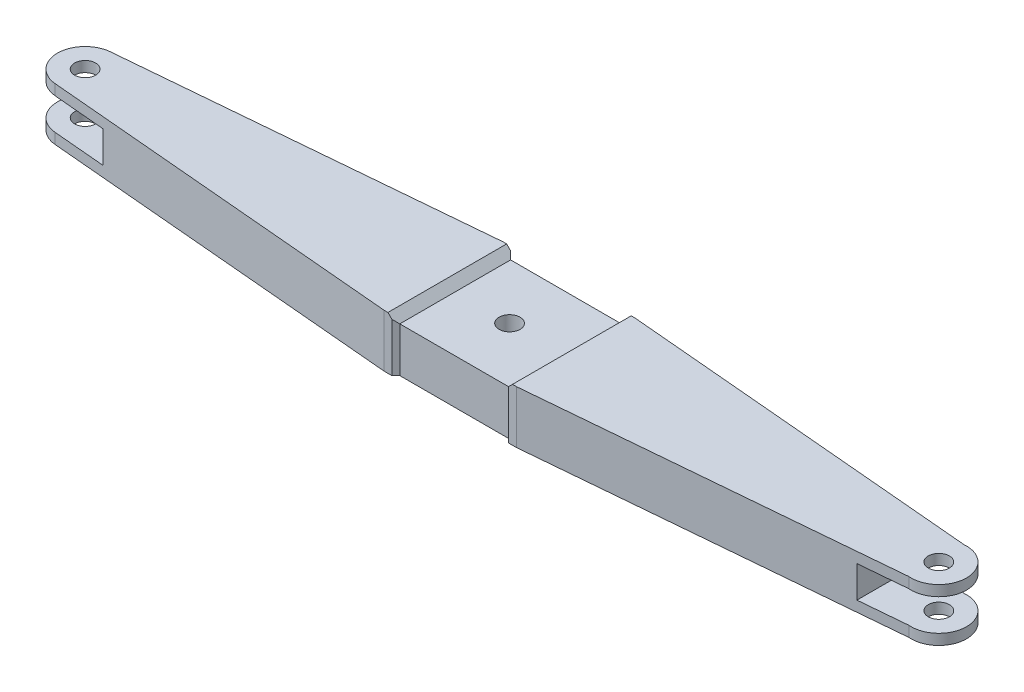
ISO-10303-21;
HEADER;
FILE_DESCRIPTION(('STEP AP214'),'2;1');
FILE_NAME('part.step','',(''),(''),'','','');
FILE_SCHEMA(('AUTOMOTIVE_DESIGN { 1 0 10303 214 1 1 1 1 }'));
ENDSEC;
DATA;
#1=APPLICATION_CONTEXT('core data for automotive mechanical design processes');
#2=APPLICATION_PROTOCOL_DEFINITION('international standard','automotive_design',2000,#1);
#3=PRODUCT_CONTEXT('',#1,'mechanical');
#4=PRODUCT('Part','Part','',(#3));
#5=PRODUCT_RELATED_PRODUCT_CATEGORY('part','',(#4));
#6=PRODUCT_DEFINITION_FORMATION('','',#4);
#7=PRODUCT_DEFINITION_CONTEXT('part definition',#1,'design');
#8=PRODUCT_DEFINITION('design','',#6,#7);
#9=PRODUCT_DEFINITION_SHAPE('','',#8);
#10=(LENGTH_UNIT() NAMED_UNIT(*) SI_UNIT(.MILLI.,.METRE.));
#11=(NAMED_UNIT(*) PLANE_ANGLE_UNIT() SI_UNIT($,.RADIAN.));
#12=(NAMED_UNIT(*) SI_UNIT($,.STERADIAN.) SOLID_ANGLE_UNIT());
#13=UNCERTAINTY_MEASURE_WITH_UNIT(LENGTH_MEASURE(1.E-05),#10,'distance_accuracy_value','');
#14=(GEOMETRIC_REPRESENTATION_CONTEXT(3) GLOBAL_UNCERTAINTY_ASSIGNED_CONTEXT((#13)) GLOBAL_UNIT_ASSIGNED_CONTEXT((#10,
#11,#12)) REPRESENTATION_CONTEXT('',''));
#15=CARTESIAN_POINT('',(0.,0.,0.));
#16=DIRECTION('',(0.,0.,1.));
#17=DIRECTION('',(1.,0.,0.));
#18=AXIS2_PLACEMENT_3D('',#15,#16,#17);
#19=CARTESIAN_POINT('',(162.738204711135,20.,-1.80061182069804E-13));
#20=DIRECTION('',(0.,1.,0.));
#21=DIRECTION('',(0.,0.,1.));
#22=AXIS2_PLACEMENT_3D('',#19,#20,#21);
#23=PLANE('',#22);
#24=DIRECTION('',(-0.999999999847692,0.,1.74532925184083E-05));
#25=VECTOR('',#24,1.);
#26=CARTESIAN_POINT('',(22.1097734828967,20.,-22.4997734828967));
#27=LINE('',#26,#25);
#28=CARTESIAN_POINT('',(25.1097734824397,20.,-22.4998258427742));
#29=VERTEX_POINT('',#28);
#30=CARTESIAN_POINT('',(23.61,20.,-22.4997996667889));
#31=VERTEX_POINT('',#30);
#32=EDGE_CURVE('E251',#29,#31,#27,.T.);
#33=ORIENTED_EDGE('',*,*,#32,.T.);
#34=DIRECTION('',(0.,0.,1.));
#35=VECTOR('',#34,1.);
#36=CARTESIAN_POINT('',(23.61,20.,21.));
#37=LINE('',#36,#35);
#38=CARTESIAN_POINT('',(23.61,20.,22.4997996667889));
#39=VERTEX_POINT('',#38);
#40=EDGE_CURVE('E325',#31,#39,#37,.T.);
#41=ORIENTED_EDGE('',*,*,#40,.T.);
#42=DIRECTION('',(0.999999999847692,0.,1.74532925207212E-05));
#43=VECTOR('',#42,1.);
#44=CARTESIAN_POINT('',(22.1097734828967,20.,22.4997734828967));
#45=LINE('',#44,#43);
#46=CARTESIAN_POINT('',(25.1097734824397,20.,22.4998258427742));
#47=VERTEX_POINT('',#46);
#48=EDGE_CURVE('E348',#39,#47,#45,.T.);
#49=ORIENTED_EDGE('',*,*,#48,.T.);
#50=DIRECTION('',(0.996144334757296,0.,-0.0877294952165169));
#51=VECTOR('',#50,1.);
#52=CARTESIAN_POINT('',(25.1097734824397,20.,22.4998258427742));
#53=LINE('',#52,#51);
#54=CARTESIAN_POINT('',(161.820621984531,20.,10.4598299192594));
#55=VERTEX_POINT('',#54);
#56=EDGE_CURVE('E418',#47,#55,#53,.T.);
#57=ORIENTED_EDGE('',*,*,#56,.T.);
#58=CARTESIAN_POINT('',(162.738204711135,20.,-1.80061182069804E-13));
#59=DIRECTION('',(0.,1.,0.));
#60=DIRECTION('',(0.,0.,1.));
#61=AXIS2_PLACEMENT_3D('',#58,#59,#60);
#62=CIRCLE('',#61,10.5);
#63=CARTESIAN_POINT('',(161.820621984531,20.,-10.4598299192597));
#64=VERTEX_POINT('',#63);
#65=EDGE_CURVE('E420',#55,#64,#62,.T.);
#66=ORIENTED_EDGE('',*,*,#65,.T.);
#67=DIRECTION('',(-0.996144334757296,0.,-0.0877294952165153));
#68=VECTOR('',#67,1.);
#69=CARTESIAN_POINT('',(25.1097734824397,20.,-22.4998258427742));
#70=LINE('',#69,#68);
#71=EDGE_CURVE('E256',#64,#29,#70,.T.);
#72=ORIENTED_EDGE('',*,*,#71,.T.);
#73=EDGE_LOOP('',(#33,#41,#49,#57,#66,#72));
#74=FACE_BOUND('',#73,.T.);
#75=CARTESIAN_POINT('',(162.738204711135,20.,-1.80061182069804E-13));
#76=DIRECTION('',(0.,1.,0.));
#77=DIRECTION('',(0.,0.,1.));
#78=AXIS2_PLACEMENT_3D('',#75,#76,#77);
#79=CIRCLE('',#78,3.99999999999999);
#80=CARTESIAN_POINT('',(162.738204711135,20.,3.99999999999981));
#81=VERTEX_POINT('',#80);
#82=EDGE_CURVE('E429',#81,#81,#79,.T.);
#83=ORIENTED_EDGE('',*,*,#82,.F.);
#84=EDGE_LOOP('',(#83));
#85=FACE_BOUND('',#84,.T.);
#86=ADVANCED_FACE('F38',(#74,#85),#23,.T.);
#87=CARTESIAN_POINT('',(-160.903039257979,20.,4.885424809878E-12));
#88=DIRECTION('',(0.,-1.,0.));
#89=DIRECTION('',(0.,0.,-1.));
#90=AXIS2_PLACEMENT_3D('',#87,#88,#89);
#91=CYLINDRICAL_SURFACE('',#90,10.5);
#92=DIRECTION('',(0.,-1.,0.));
#93=VECTOR('',#92,1.);
#94=CARTESIAN_POINT('',(-161.820621984532,20.,10.4598299192689));
#95=LINE('',#94,#93);
#96=CARTESIAN_POINT('',(-161.820621984532,4.,10.4598299192689));
#97=VERTEX_POINT('',#96);
#98=CARTESIAN_POINT('',(-161.820621984532,0.,10.4598299192689));
#99=VERTEX_POINT('',#98);
#100=EDGE_CURVE('E285',#97,#99,#95,.T.);
#101=ORIENTED_EDGE('',*,*,#100,.F.);
#102=CARTESIAN_POINT('',(-160.903039257979,4.,4.885424809878E-12));
#103=DIRECTION('',(0.,-1.,0.));
#104=DIRECTION('',(0.,0.,-1.));
#105=AXIS2_PLACEMENT_3D('',#102,#103,#104);
#106=CIRCLE('',#105,10.5);
#107=CARTESIAN_POINT('',(-161.820621984531,4.,-10.4598299192593));
#108=VERTEX_POINT('',#107);
#109=EDGE_CURVE('E445',#97,#108,#106,.T.);
#110=ORIENTED_EDGE('',*,*,#109,.T.);
#111=DIRECTION('',(0.,-1.,0.));
#112=VECTOR('',#111,1.);
#113=CARTESIAN_POINT('',(-161.820621984531,20.,-10.4598299192593));
#114=LINE('',#113,#112);
#115=CARTESIAN_POINT('',(-161.820621984531,0.,-10.4598299192593));
#116=VERTEX_POINT('',#115);
#117=EDGE_CURVE('E289',#108,#116,#114,.T.);
#118=ORIENTED_EDGE('',*,*,#117,.T.);
#119=CARTESIAN_POINT('',(-160.903039257979,0.,4.885424809878E-12));
#120=DIRECTION('',(0.,1.,0.));
#121=DIRECTION('',(0.,0.,1.));
#122=AXIS2_PLACEMENT_3D('',#119,#120,#121);
#123=CIRCLE('',#122,10.5);
#124=EDGE_CURVE('E376',#116,#99,#123,.T.);
#125=ORIENTED_EDGE('',*,*,#124,.T.);
#126=EDGE_LOOP('',(#101,#110,#118,#125));
#127=FACE_BOUND('',#126,.T.);
#128=ADVANCED_FACE('F506',(#127),#91,.T.);
#129=CARTESIAN_POINT('',(162.738204711135,20.,-1.80061182069804E-13));
#130=DIRECTION('',(0.,-1.,0.));
#131=DIRECTION('',(0.,0.,-1.));
#132=AXIS2_PLACEMENT_3D('',#129,#130,#131);
#133=CYLINDRICAL_SURFACE('',#132,10.5);
#134=DIRECTION('',(0.,-1.,0.));
#135=VECTOR('',#134,1.);
#136=CARTESIAN_POINT('',(161.820621984531,20.,-10.4598299192597));
#137=LINE('',#136,#135);
#138=CARTESIAN_POINT('',(161.820621984531,4.,-10.4598299192597));
#139=VERTEX_POINT('',#138);
#140=CARTESIAN_POINT('',(161.820621984531,0.,-10.4598299192597));
#141=VERTEX_POINT('',#140);
#142=EDGE_CURVE('E263',#139,#141,#137,.T.);
#143=ORIENTED_EDGE('',*,*,#142,.F.);
#144=CARTESIAN_POINT('',(162.738204711135,4.,-1.80061182069804E-13));
#145=DIRECTION('',(0.,-1.,0.));
#146=DIRECTION('',(0.,0.,-1.));
#147=AXIS2_PLACEMENT_3D('',#144,#145,#146);
#148=CIRCLE('',#147,10.5);
#149=CARTESIAN_POINT('',(161.820621984531,4.,10.4598299192594));
#150=VERTEX_POINT('',#149);
#151=EDGE_CURVE('E458',#139,#150,#148,.T.);
#152=ORIENTED_EDGE('',*,*,#151,.T.);
#153=DIRECTION('',(0.,-1.,0.));
#154=VECTOR('',#153,1.);
#155=CARTESIAN_POINT('',(161.820621984531,20.,10.4598299192594));
#156=LINE('',#155,#154);
#157=CARTESIAN_POINT('',(161.820621984531,0.,10.4598299192594));
#158=VERTEX_POINT('',#157);
#159=EDGE_CURVE('E267',#150,#158,#156,.T.);
#160=ORIENTED_EDGE('',*,*,#159,.T.);
#161=CARTESIAN_POINT('',(162.738204711135,0.,-1.80061182069804E-13));
#162=DIRECTION('',(0.,1.,0.));
#163=DIRECTION('',(0.,0.,1.));
#164=AXIS2_PLACEMENT_3D('',#161,#162,#163);
#165=CIRCLE('',#164,10.5);
#166=EDGE_CURVE('E399',#158,#141,#165,.T.);
#167=ORIENTED_EDGE('',*,*,#166,.T.);
#168=EDGE_LOOP('',(#143,#152,#160,#167));
#169=FACE_BOUND('',#168,.T.);
#170=ADVANCED_FACE('F512',(#169),#133,.T.);
#171=CARTESIAN_POINT('',(-160.903039257979,20.,4.885424809878E-12));
#172=DIRECTION('',(0.,-1.,0.));
#173=DIRECTION('',(0.,0.,-1.));
#174=AXIS2_PLACEMENT_3D('',#171,#172,#173);
#175=CYLINDRICAL_SURFACE('',#174,3.99999999999999);
#176=CARTESIAN_POINT('',(-160.903039257979,4.,4.885424809878E-12));
#177=DIRECTION('',(0.,-1.,0.));
#178=DIRECTION('',(0.,0.,-1.));
#179=AXIS2_PLACEMENT_3D('',#176,#177,#178);
#180=CIRCLE('',#179,3.99999999999999);
#181=CARTESIAN_POINT('',(-160.903039257979,4.,-3.99999999999511));
#182=VERTEX_POINT('',#181);
#183=EDGE_CURVE('E315',#182,#182,#180,.T.);
#184=ORIENTED_EDGE('',*,*,#183,.F.);
#185=EDGE_LOOP('',(#184));
#186=FACE_BOUND('',#185,.T.);
#187=CARTESIAN_POINT('',(-160.903039257979,0.,4.885424809878E-12));
#188=DIRECTION('',(0.,1.,0.));
#189=DIRECTION('',(0.,0.,1.));
#190=AXIS2_PLACEMENT_3D('',#187,#188,#189);
#191=CIRCLE('',#190,3.99999999999999);
#192=CARTESIAN_POINT('',(-160.903039257979,0.,4.00000000000488));
#193=VERTEX_POINT('',#192);
#194=EDGE_CURVE('E412',#193,#193,#191,.T.);
#195=ORIENTED_EDGE('',*,*,#194,.F.);
#196=EDGE_LOOP('',(#195));
#197=FACE_BOUND('',#196,.T.);
#198=ADVANCED_FACE('F525',(#186,#197),#175,.F.);
#199=CARTESIAN_POINT('',(162.738204711135,20.,-1.80061182069804E-13));
#200=DIRECTION('',(0.,-1.,0.));
#201=DIRECTION('',(0.,0.,-1.));
#202=AXIS2_PLACEMENT_3D('',#199,#200,#201);
#203=CYLINDRICAL_SURFACE('',#202,3.99999999999999);
#204=CARTESIAN_POINT('',(162.738204711135,4.,-1.80061182069804E-13));
#205=DIRECTION('',(0.,-1.,0.));
#206=DIRECTION('',(0.,0.,-1.));
#207=AXIS2_PLACEMENT_3D('',#204,#205,#206);
#208=CIRCLE('',#207,3.99999999999999);
#209=CARTESIAN_POINT('',(162.738204711135,4.,-4.00000000000017));
#210=VERTEX_POINT('',#209);
#211=EDGE_CURVE('E305',#210,#210,#208,.T.);
#212=ORIENTED_EDGE('',*,*,#211,.F.);
#213=EDGE_LOOP('',(#212));
#214=FACE_BOUND('',#213,.T.);
#215=CARTESIAN_POINT('',(162.738204711135,0.,-1.80061182069804E-13));
#216=DIRECTION('',(0.,1.,0.));
#217=DIRECTION('',(0.,0.,1.));
#218=AXIS2_PLACEMENT_3D('',#215,#216,#217);
#219=CIRCLE('',#218,3.99999999999999);
#220=CARTESIAN_POINT('',(162.738204711135,0.,3.99999999999981));
#221=VERTEX_POINT('',#220);
#222=EDGE_CURVE('E431',#221,#221,#219,.T.);
#223=ORIENTED_EDGE('',*,*,#222,.F.);
#224=EDGE_LOOP('',(#223));
#225=FACE_BOUND('',#224,.T.);
#226=ADVANCED_FACE('F520',(#214,#225),#203,.F.);
#227=DIRECTION('',(0.999999999847691,0.,-1.74532925137825E-05));
#228=VECTOR('',#227,1.);
#229=CARTESIAN_POINT('',(-22.1097734828967,20.,22.4997734828967));
#230=LINE('',#229,#228);
#231=CARTESIAN_POINT('',(-25.1097734824397,20.,22.4998258427742));
#232=VERTEX_POINT('',#231);
#233=CARTESIAN_POINT('',(-23.61,20.,22.4997996667889));
#234=VERTEX_POINT('',#233);
#235=EDGE_CURVE('E340',#232,#234,#230,.T.);
#236=ORIENTED_EDGE('',*,*,#235,.T.);
#237=DIRECTION('',(0.,0.,-1.));
#238=VECTOR('',#237,1.);
#239=CARTESIAN_POINT('',(-23.61,20.,-21.));
#240=LINE('',#239,#238);
#241=CARTESIAN_POINT('',(-23.61,20.,-22.4997996667889));
#242=VERTEX_POINT('',#241);
#243=EDGE_CURVE('E61',#234,#242,#240,.T.);
#244=ORIENTED_EDGE('',*,*,#243,.T.);
#245=DIRECTION('',(-0.999999999847692,0.,-1.74532925172518E-05));
#246=VECTOR('',#245,1.);
#247=CARTESIAN_POINT('',(-22.1097734828967,20.,-22.4997734828967));
#248=LINE('',#247,#246);
#249=CARTESIAN_POINT('',(-25.1097734824397,20.,-22.4998258427742));
#250=VERTEX_POINT('',#249);
#251=EDGE_CURVE('E407',#242,#250,#248,.T.);
#252=ORIENTED_EDGE('',*,*,#251,.T.);
#253=DIRECTION('',(-0.996144334757296,0.,0.0877294952165174));
#254=VECTOR('',#253,1.);
#255=CARTESIAN_POINT('',(-25.1097734824397,20.,-22.4998258427742));
#256=LINE('',#255,#254);
#257=CARTESIAN_POINT('',(-161.820621984531,20.,-10.4598299192593));
#258=VERTEX_POINT('',#257);
#259=EDGE_CURVE('E371',#250,#258,#256,.T.);
#260=ORIENTED_EDGE('',*,*,#259,.T.);
#261=CARTESIAN_POINT('',(-160.903039257979,20.,4.885424809878E-12));
#262=DIRECTION('',(0.,1.,0.));
#263=DIRECTION('',(0.,0.,1.));
#264=AXIS2_PLACEMENT_3D('',#261,#262,#263);
#265=CIRCLE('',#264,10.5);
#266=CARTESIAN_POINT('',(-161.820621984532,20.,10.4598299192689));
#267=VERTEX_POINT('',#266);
#268=EDGE_CURVE('E409',#258,#267,#265,.T.);
#269=ORIENTED_EDGE('',*,*,#268,.T.);
#270=DIRECTION('',(0.996144334757302,0.,0.0877294952164476));
#271=VECTOR('',#270,1.);
#272=CARTESIAN_POINT('',(-25.1097734824397,20.,22.4998258427742));
#273=LINE('',#272,#271);
#274=EDGE_CURVE('E346',#267,#232,#273,.T.);
#275=ORIENTED_EDGE('',*,*,#274,.T.);
#276=EDGE_LOOP('',(#236,#244,#252,#260,#269,#275));
#277=FACE_BOUND('',#276,.T.);
#278=CARTESIAN_POINT('',(-160.903039257979,20.,4.885424809878E-12));
#279=DIRECTION('',(0.,1.,0.));
#280=DIRECTION('',(0.,0.,1.));
#281=AXIS2_PLACEMENT_3D('',#278,#279,#280);
#282=CIRCLE('',#281,3.99999999999999);
#283=CARTESIAN_POINT('',(-160.903039257979,20.,4.00000000000488));
#284=VERTEX_POINT('',#283);
#285=EDGE_CURVE('E424',#284,#284,#282,.T.);
#286=ORIENTED_EDGE('',*,*,#285,.F.);
#287=EDGE_LOOP('',(#286));
#288=FACE_BOUND('',#287,.T.);
#289=ADVANCED_FACE('F343',(#277,#288),#23,.T.);
#290=CARTESIAN_POINT('',(162.738204711135,0.,-1.80061182069804E-13));
#291=DIRECTION('',(0.,1.,0.));
#292=DIRECTION('',(0.,0.,1.));
#293=AXIS2_PLACEMENT_3D('',#290,#291,#292);
#294=PLANE('',#293);
#295=CARTESIAN_POINT('',(0.,0.,0.));
#296=DIRECTION('',(0.,1.,0.));
#297=DIRECTION('',(0.,0.,1.));
#298=AXIS2_PLACEMENT_3D('',#295,#296,#297);
#299=CIRCLE('',#298,4.);
#300=CARTESIAN_POINT('',(0.,0.,4.));
#301=VERTEX_POINT('',#300);
#302=EDGE_CURVE('E235',#301,#301,#299,.T.);
#303=ORIENTED_EDGE('',*,*,#302,.T.);
#304=EDGE_LOOP('',(#303));
#305=FACE_BOUND('',#304,.T.);
#306=DIRECTION('',(-1.,0.,0.));
#307=VECTOR('',#306,1.);
#308=CARTESIAN_POINT('',(-20.61,0.,-21.));
#309=LINE('',#308,#307);
#310=CARTESIAN_POINT('',(20.61,0.,-21.));
#311=VERTEX_POINT('',#310);
#312=CARTESIAN_POINT('',(-20.61,0.,-21.));
#313=VERTEX_POINT('',#312);
#314=EDGE_CURVE('E423',#311,#313,#309,.T.);
#315=ORIENTED_EDGE('',*,*,#314,.F.);
#316=DIRECTION('',(-0.707106781186548,0.,0.707106781186548));
#317=VECTOR('',#316,1.);
#318=CARTESIAN_POINT('',(20.61,0.,-21.));
#319=LINE('',#318,#317);
#320=CARTESIAN_POINT('',(22.1097734828967,0.,-22.4997734828967));
#321=VERTEX_POINT('',#320);
#322=EDGE_CURVE('E248',#321,#311,#319,.T.);
#323=ORIENTED_EDGE('',*,*,#322,.F.);
#324=DIRECTION('',(-0.999999999847692,0.,1.74532925184083E-05));
#325=VECTOR('',#324,1.);
#326=CARTESIAN_POINT('',(22.1097734828967,0.,-22.4997734828967));
#327=LINE('',#326,#325);
#328=CARTESIAN_POINT('',(25.1097734824397,0.,-22.4998258427742));
#329=VERTEX_POINT('',#328);
#330=EDGE_CURVE('E403',#329,#321,#327,.T.);
#331=ORIENTED_EDGE('',*,*,#330,.F.);
#332=DIRECTION('',(-0.996144334757296,0.,-0.0877294952165153));
#333=VECTOR('',#332,1.);
#334=CARTESIAN_POINT('',(25.1097734824397,0.,-22.4998258427742));
#335=LINE('',#334,#333);
#336=EDGE_CURVE('E402',#141,#329,#335,.T.);
#337=ORIENTED_EDGE('',*,*,#336,.F.);
#338=ORIENTED_EDGE('',*,*,#166,.F.);
#339=DIRECTION('',(0.996144334757296,0.,-0.0877294952165169));
#340=VECTOR('',#339,1.);
#341=CARTESIAN_POINT('',(25.1097734824397,0.,22.4998258427742));
#342=LINE('',#341,#340);
#343=CARTESIAN_POINT('',(25.1097734824397,0.,22.4998258427742));
#344=VERTEX_POINT('',#343);
#345=EDGE_CURVE('E396',#344,#158,#342,.T.);
#346=ORIENTED_EDGE('',*,*,#345,.F.);
#347=DIRECTION('',(0.999999999847692,0.,1.74532925207212E-05));
#348=VECTOR('',#347,1.);
#349=CARTESIAN_POINT('',(22.1097734828967,0.,22.4997734828967));
#350=LINE('',#349,#348);
#351=CARTESIAN_POINT('',(22.1097734828967,0.,22.4997734828967));
#352=VERTEX_POINT('',#351);
#353=EDGE_CURVE('E394',#352,#344,#350,.T.);
#354=ORIENTED_EDGE('',*,*,#353,.F.);
#355=DIRECTION('',(0.707106781186548,0.,0.707106781186548));
#356=VECTOR('',#355,1.);
#357=CARTESIAN_POINT('',(20.61,0.,21.));
#358=LINE('',#357,#356);
#359=CARTESIAN_POINT('',(20.61,0.,21.));
#360=VERTEX_POINT('',#359);
#361=EDGE_CURVE('E391',#360,#352,#358,.T.);
#362=ORIENTED_EDGE('',*,*,#361,.F.);
#363=DIRECTION('',(1.,0.,0.));
#364=VECTOR('',#363,1.);
#365=CARTESIAN_POINT('',(-20.61,0.,21.));
#366=LINE('',#365,#364);
#367=CARTESIAN_POINT('',(-20.61,0.,21.));
#368=VERTEX_POINT('',#367);
#369=EDGE_CURVE('E388',#368,#360,#366,.T.);
#370=ORIENTED_EDGE('',*,*,#369,.F.);
#371=DIRECTION('',(0.707106781186551,0.,-0.707106781186544));
#372=VECTOR('',#371,1.);
#373=CARTESIAN_POINT('',(-20.61,0.,21.));
#374=LINE('',#373,#372);
#375=CARTESIAN_POINT('',(-22.1097734828967,0.,22.4997734828967));
#376=VERTEX_POINT('',#375);
#377=EDGE_CURVE('E385',#376,#368,#374,.T.);
#378=ORIENTED_EDGE('',*,*,#377,.F.);
#379=DIRECTION('',(0.999999999847691,0.,-1.74532925137825E-05));
#380=VECTOR('',#379,1.);
#381=CARTESIAN_POINT('',(-22.1097734828967,0.,22.4997734828967));
#382=LINE('',#381,#380);
#383=CARTESIAN_POINT('',(-25.1097734824397,0.,22.4998258427742));
#384=VERTEX_POINT('',#383);
#385=EDGE_CURVE('E383',#384,#376,#382,.T.);
#386=ORIENTED_EDGE('',*,*,#385,.F.);
#387=DIRECTION('',(0.996144334757302,0.,0.0877294952164476));
#388=VECTOR('',#387,1.);
#389=CARTESIAN_POINT('',(-25.1097734824397,0.,22.4998258427742));
#390=LINE('',#389,#388);
#391=EDGE_CURVE('E378',#99,#384,#390,.T.);
#392=ORIENTED_EDGE('',*,*,#391,.F.);
#393=ORIENTED_EDGE('',*,*,#124,.F.);
#394=DIRECTION('',(-0.996144334757296,0.,0.0877294952165174));
#395=VECTOR('',#394,1.);
#396=CARTESIAN_POINT('',(-25.1097734824397,0.,-22.4998258427742));
#397=LINE('',#396,#395);
#398=CARTESIAN_POINT('',(-25.1097734824397,0.,-22.4998258427742));
#399=VERTEX_POINT('',#398);
#400=EDGE_CURVE('E363',#399,#116,#397,.T.);
#401=ORIENTED_EDGE('',*,*,#400,.F.);
#402=DIRECTION('',(-0.999999999847692,0.,-1.74532925172518E-05));
#403=VECTOR('',#402,1.);
#404=CARTESIAN_POINT('',(-22.1097734828967,0.,-22.4997734828967));
#405=LINE('',#404,#403);
#406=CARTESIAN_POINT('',(-22.1097734828967,0.,-22.4997734828967));
#407=VERTEX_POINT('',#406);
#408=EDGE_CURVE('E359',#407,#399,#405,.T.);
#409=ORIENTED_EDGE('',*,*,#408,.F.);
#410=DIRECTION('',(-0.707106781186548,0.,-0.707106781186548));
#411=VECTOR('',#410,1.);
#412=CARTESIAN_POINT('',(-20.61,0.,-21.));
#413=LINE('',#412,#411);
#414=EDGE_CURVE('E355',#313,#407,#413,.T.);
#415=ORIENTED_EDGE('',*,*,#414,.F.);
#416=EDGE_LOOP('',(#315,#323,#331,#337,#338,#346,#354,#362,#370,#378,#386,#392,#393,#401,#409,#415));
#417=FACE_BOUND('',#416,.T.);
#418=ORIENTED_EDGE('',*,*,#194,.T.);
#419=EDGE_LOOP('',(#418));
#420=FACE_BOUND('',#419,.T.);
#421=ORIENTED_EDGE('',*,*,#222,.T.);
#422=EDGE_LOOP('',(#421));
#423=FACE_BOUND('',#422,.T.);
#424=ADVANCED_FACE('F372',(#305,#417,#420,#423),#294,.F.);
#425=CARTESIAN_POINT('',(-20.61,20.,-21.));
#426=DIRECTION('',(0.,0.,1.));
#427=DIRECTION('',(1.,0.,0.));
#428=AXIS2_PLACEMENT_3D('',#425,#426,#427);
#429=PLANE('',#428);
#430=DIRECTION('',(0.,-1.,0.));
#431=VECTOR('',#430,1.);
#432=CARTESIAN_POINT('',(-20.61,20.,-21.));
#433=LINE('',#432,#431);
#434=CARTESIAN_POINT('',(-20.61,17.,-21.));
#435=VERTEX_POINT('',#434);
#436=EDGE_CURVE('E242',#435,#313,#433,.T.);
#437=ORIENTED_EDGE('',*,*,#436,.F.);
#438=DIRECTION('',(-1.,0.,0.));
#439=VECTOR('',#438,1.);
#440=CARTESIAN_POINT('',(-20.61,17.,-21.));
#441=LINE('',#440,#439);
#442=CARTESIAN_POINT('',(20.61,17.,-21.));
#443=VERTEX_POINT('',#442);
#444=EDGE_CURVE('E230',#443,#435,#441,.T.);
#445=ORIENTED_EDGE('',*,*,#444,.F.);
#446=DIRECTION('',(0.,-1.,0.));
#447=VECTOR('',#446,1.);
#448=CARTESIAN_POINT('',(20.61,20.,-21.));
#449=LINE('',#448,#447);
#450=EDGE_CURVE('E240',#443,#311,#449,.T.);
#451=ORIENTED_EDGE('',*,*,#450,.T.);
#452=ORIENTED_EDGE('',*,*,#314,.T.);
#453=EDGE_LOOP('',(#437,#445,#451,#452));
#454=FACE_BOUND('',#453,.T.);
#455=ADVANCED_FACE('F238',(#454),#429,.F.);
#456=CARTESIAN_POINT('',(-20.61,20.,-21.));
#457=DIRECTION('',(-0.707106781186548,0.,0.707106781186548));
#458=DIRECTION('',(0.707106781186548,0.,0.707106781186548));
#459=AXIS2_PLACEMENT_3D('',#456,#457,#458);
#460=PLANE('',#459);
#461=DIRECTION('',(0.,-1.,0.));
#462=VECTOR('',#461,1.);
#463=CARTESIAN_POINT('',(-22.1097734828967,20.,-22.4997734828967));
#464=LINE('',#463,#462);
#465=CARTESIAN_POINT('',(-22.1097734828967,18.4997734828967,-22.4997734828967));
#466=VERTEX_POINT('',#465);
#467=EDGE_CURVE('E296',#466,#407,#464,.T.);
#468=ORIENTED_EDGE('',*,*,#467,.F.);
#469=DIRECTION('',(0.577350269189627,-0.577350269189623,0.577350269189627));
#470=VECTOR('',#469,1.);
#471=CARTESIAN_POINT('',(-6.60999999999992,3.00000000000004,-6.99999999999992));
#472=LINE('',#471,#470);
#473=EDGE_CURVE('E11',#466,#435,#472,.T.);
#474=ORIENTED_EDGE('',*,*,#473,.T.);
#475=ORIENTED_EDGE('',*,*,#436,.T.);
#476=ORIENTED_EDGE('',*,*,#414,.T.);
#477=EDGE_LOOP('',(#468,#474,#475,#476));
#478=FACE_BOUND('',#477,.T.);
#479=ADVANCED_FACE('F352',(#478),#460,.F.);
#480=CARTESIAN_POINT('',(-22.1097734828967,20.,-22.4997734828967));
#481=DIRECTION('',(-1.74532925172518E-05,0.,0.999999999847691));
#482=DIRECTION('',(0.999999999847691,0.,1.74532925172518E-05));
#483=AXIS2_PLACEMENT_3D('',#480,#481,#482);
#484=PLANE('',#483);
#485=ORIENTED_EDGE('',*,*,#251,.F.);
#486=DIRECTION('',(0.707106781132701,-0.707106781132695,1.23413414939211E-05));
#487=VECTOR('',#486,1.);
#488=CARTESIAN_POINT('',(-20.6096203930929,16.9996203930929,-22.499747300286));
#489=LINE('',#488,#487);
#490=EDGE_CURVE('E47',#242,#466,#489,.T.);
#491=ORIENTED_EDGE('',*,*,#490,.T.);
#492=ORIENTED_EDGE('',*,*,#467,.T.);
#493=ORIENTED_EDGE('',*,*,#408,.T.);
#494=DIRECTION('',(0.,-1.,0.));
#495=VECTOR('',#494,1.);
#496=CARTESIAN_POINT('',(-25.1097734824397,20.,-22.4998258427742));
#497=LINE('',#496,#495);
#498=EDGE_CURVE('E293',#250,#399,#497,.T.);
#499=ORIENTED_EDGE('',*,*,#498,.F.);
#500=EDGE_LOOP('',(#485,#491,#492,#493,#499));
#501=FACE_BOUND('',#500,.T.);
#502=ADVANCED_FACE('F357',(#501),#484,.F.);
#503=CARTESIAN_POINT('',(-25.1097734824397,20.,-22.4998258427742));
#504=DIRECTION('',(0.0877294952165174,0.,0.996144334757296));
#505=DIRECTION('',(0.996144334757296,0.,-0.0877294952165174));
#506=AXIS2_PLACEMENT_3D('',#503,#504,#505);
#507=PLANE('',#506);
#508=ORIENTED_EDGE('',*,*,#117,.F.);
#509=DIRECTION('',(0.996144334757296,0.,-0.0877294952165174));
#510=VECTOR('',#509,1.);
#511=CARTESIAN_POINT('',(-25.1097734824397,4.,-22.4998258427742));
#512=LINE('',#511,#510);
#513=CARTESIAN_POINT('',(-141.903039257979,4.,-12.2139527080612));
#514=VERTEX_POINT('',#513);
#515=EDGE_CURVE('E442',#108,#514,#512,.T.);
#516=ORIENTED_EDGE('',*,*,#515,.T.);
#517=DIRECTION('',(0.,1.,0.));
#518=VECTOR('',#517,1.);
#519=CARTESIAN_POINT('',(-141.903039257979,20.,-12.2139527080612));
#520=LINE('',#519,#518);
#521=CARTESIAN_POINT('',(-141.903039257979,16.,-12.2139527080612));
#522=VERTEX_POINT('',#521);
#523=EDGE_CURVE('E434',#514,#522,#520,.T.);
#524=ORIENTED_EDGE('',*,*,#523,.T.);
#525=DIRECTION('',(-0.996144334757296,0.,0.0877294952165174));
#526=VECTOR('',#525,1.);
#527=CARTESIAN_POINT('',(-25.1097734824397,16.,-22.4998258427742));
#528=LINE('',#527,#526);
#529=CARTESIAN_POINT('',(-161.820621984531,16.,-10.4598299192593));
#530=VERTEX_POINT('',#529);
#531=EDGE_CURVE('E319',#522,#530,#528,.T.);
#532=ORIENTED_EDGE('',*,*,#531,.T.);
#533=EDGE_CURVE('E290',#258,#530,#114,.T.);
#534=ORIENTED_EDGE('',*,*,#533,.F.);
#535=ORIENTED_EDGE('',*,*,#259,.F.);
#536=ORIENTED_EDGE('',*,*,#498,.T.);
#537=ORIENTED_EDGE('',*,*,#400,.T.);
#538=EDGE_LOOP('',(#508,#516,#524,#532,#534,#535,#536,#537));
#539=FACE_BOUND('',#538,.T.);
#540=ADVANCED_FACE('F368',(#539),#507,.F.);
#541=CARTESIAN_POINT('',(-160.903039257979,16.,4.885424809878E-12));
#542=DIRECTION('',(0.,1.,0.));
#543=DIRECTION('',(0.,0.,1.));
#544=AXIS2_PLACEMENT_3D('',#541,#542,#543);
#545=CIRCLE('',#544,10.5);
#546=CARTESIAN_POINT('',(-161.820621984532,16.,10.4598299192689));
#547=VERTEX_POINT('',#546);
#548=EDGE_CURVE('E452',#530,#547,#545,.T.);
#549=ORIENTED_EDGE('',*,*,#548,.T.);
#550=EDGE_CURVE('E286',#267,#547,#95,.T.);
#551=ORIENTED_EDGE('',*,*,#550,.F.);
#552=ORIENTED_EDGE('',*,*,#268,.F.);
#553=ORIENTED_EDGE('',*,*,#533,.T.);
#554=EDGE_LOOP('',(#549,#551,#552,#553));
#555=FACE_BOUND('',#554,.T.);
#556=ADVANCED_FACE('F515',(#555),#91,.T.);
#557=CARTESIAN_POINT('',(-25.1097734824397,20.,22.4998258427742));
#558=DIRECTION('',(0.0877294952164476,0.,-0.996144334757302));
#559=DIRECTION('',(-0.996144334757302,0.,-0.0877294952164476));
#560=AXIS2_PLACEMENT_3D('',#557,#558,#559);
#561=PLANE('',#560);
#562=DIRECTION('',(0.,-1.,0.));
#563=VECTOR('',#562,1.);
#564=CARTESIAN_POINT('',(-141.903039257979,20.,12.2139527080695));
#565=LINE('',#564,#563);
#566=CARTESIAN_POINT('',(-141.903039257979,16.,12.2139527080695));
#567=VERTEX_POINT('',#566);
#568=CARTESIAN_POINT('',(-141.903039257979,4.,12.2139527080695));
#569=VERTEX_POINT('',#568);
#570=EDGE_CURVE('E222',#567,#569,#565,.T.);
#571=ORIENTED_EDGE('',*,*,#570,.T.);
#572=DIRECTION('',(-0.996144334757302,0.,-0.0877294952164476));
#573=VECTOR('',#572,1.);
#574=CARTESIAN_POINT('',(-25.1097734824397,4.,22.4998258427742));
#575=LINE('',#574,#573);
#576=EDGE_CURVE('E318',#569,#97,#575,.T.);
#577=ORIENTED_EDGE('',*,*,#576,.T.);
#578=ORIENTED_EDGE('',*,*,#100,.T.);
#579=ORIENTED_EDGE('',*,*,#391,.T.);
#580=DIRECTION('',(0.,-1.,0.));
#581=VECTOR('',#580,1.);
#582=CARTESIAN_POINT('',(-25.1097734824397,20.,22.4998258427742));
#583=LINE('',#582,#581);
#584=EDGE_CURVE('E282',#232,#384,#583,.T.);
#585=ORIENTED_EDGE('',*,*,#584,.F.);
#586=ORIENTED_EDGE('',*,*,#274,.F.);
#587=ORIENTED_EDGE('',*,*,#550,.T.);
#588=DIRECTION('',(0.996144334757302,0.,0.0877294952164476));
#589=VECTOR('',#588,1.);
#590=CARTESIAN_POINT('',(-25.1097734824397,16.,22.4998258427742));
#591=LINE('',#590,#589);
#592=EDGE_CURVE('E313',#547,#567,#591,.T.);
#593=ORIENTED_EDGE('',*,*,#592,.T.);
#594=EDGE_LOOP('',(#571,#577,#578,#579,#585,#586,#587,#593));
#595=FACE_BOUND('',#594,.T.);
#596=ADVANCED_FACE('F598',(#595),#561,.F.);
#597=CARTESIAN_POINT('',(-22.1097734828967,20.,22.4997734828967));
#598=DIRECTION('',(-1.74532925137825E-05,0.,-0.999999999847691));
#599=DIRECTION('',(-0.999999999847691,0.,1.74532925137825E-05));
#600=AXIS2_PLACEMENT_3D('',#597,#598,#599);
#601=PLANE('',#600);
#602=DIRECTION('',(0.,-1.,0.));
#603=VECTOR('',#602,1.);
#604=CARTESIAN_POINT('',(-22.1097734828967,20.,22.4997734828967));
#605=LINE('',#604,#603);
#606=CARTESIAN_POINT('',(-22.1097734828967,18.4997734828967,22.4997734828967));
#607=VERTEX_POINT('',#606);
#608=EDGE_CURVE('E280',#607,#376,#605,.T.);
#609=ORIENTED_EDGE('',*,*,#608,.F.);
#610=DIRECTION('',(-0.707106781132701,0.707106781132695,1.23413414914679E-05));
#611=VECTOR('',#610,1.);
#612=CARTESIAN_POINT('',(-20.6099869122358,16.9999869122358,22.4997473066829));
#613=LINE('',#612,#611);
#614=EDGE_CURVE('E333',#607,#234,#613,.T.);
#615=ORIENTED_EDGE('',*,*,#614,.T.);
#616=ORIENTED_EDGE('',*,*,#235,.F.);
#617=ORIENTED_EDGE('',*,*,#584,.T.);
#618=ORIENTED_EDGE('',*,*,#385,.T.);
#619=EDGE_LOOP('',(#609,#615,#616,#617,#618));
#620=FACE_BOUND('',#619,.T.);
#621=ADVANCED_FACE('F339',(#620),#601,.F.);
#622=CARTESIAN_POINT('',(-20.61,20.,21.));
#623=DIRECTION('',(-0.707106781186544,0.,-0.707106781186551));
#624=DIRECTION('',(-0.707106781186551,0.,0.707106781186544));
#625=AXIS2_PLACEMENT_3D('',#622,#623,#624);
#626=PLANE('',#625);
#627=DIRECTION('',(0.,-1.,0.));
#628=VECTOR('',#627,1.);
#629=CARTESIAN_POINT('',(-20.61,20.,21.));
#630=LINE('',#629,#628);
#631=CARTESIAN_POINT('',(-20.61,17.,21.));
#632=VERTEX_POINT('',#631);
#633=EDGE_CURVE('E278',#632,#368,#630,.T.);
#634=ORIENTED_EDGE('',*,*,#633,.F.);
#635=DIRECTION('',(-0.577350269189629,0.577350269189624,0.577350269189624));
#636=VECTOR('',#635,1.);
#637=CARTESIAN_POINT('',(-20.61,17.,21.));
#638=LINE('',#637,#636);
#639=EDGE_CURVE('E331',#632,#607,#638,.T.);
#640=ORIENTED_EDGE('',*,*,#639,.T.);
#641=ORIENTED_EDGE('',*,*,#608,.T.);
#642=ORIENTED_EDGE('',*,*,#377,.T.);
#643=EDGE_LOOP('',(#634,#640,#641,#642));
#644=FACE_BOUND('',#643,.T.);
#645=ADVANCED_FACE('F596',(#644),#626,.F.);
#646=CARTESIAN_POINT('',(-20.61,20.,21.));
#647=DIRECTION('',(0.,0.,-1.));
#648=DIRECTION('',(-1.,0.,0.));
#649=AXIS2_PLACEMENT_3D('',#646,#647,#648);
#650=PLANE('',#649);
#651=DIRECTION('',(0.,-1.,0.));
#652=VECTOR('',#651,1.);
#653=CARTESIAN_POINT('',(20.61,20.,21.));
#654=LINE('',#653,#652);
#655=CARTESIAN_POINT('',(20.61,17.,21.));
#656=VERTEX_POINT('',#655);
#657=EDGE_CURVE('E276',#656,#360,#654,.T.);
#658=ORIENTED_EDGE('',*,*,#657,.F.);
#659=DIRECTION('',(1.,0.,0.));
#660=VECTOR('',#659,1.);
#661=CARTESIAN_POINT('',(-20.61,17.,21.));
#662=LINE('',#661,#660);
#663=EDGE_CURVE('E233',#632,#656,#662,.T.);
#664=ORIENTED_EDGE('',*,*,#663,.F.);
#665=ORIENTED_EDGE('',*,*,#633,.T.);
#666=ORIENTED_EDGE('',*,*,#369,.T.);
#667=EDGE_LOOP('',(#658,#664,#665,#666));
#668=FACE_BOUND('',#667,.T.);
#669=ADVANCED_FACE('F593',(#668),#650,.F.);
#670=CARTESIAN_POINT('',(20.61,20.,21.));
#671=DIRECTION('',(0.707106781186548,0.,-0.707106781186548));
#672=DIRECTION('',(-0.707106781186548,0.,-0.707106781186548));
#673=AXIS2_PLACEMENT_3D('',#670,#671,#672);
#674=PLANE('',#673);
#675=DIRECTION('',(0.,-1.,0.));
#676=VECTOR('',#675,1.);
#677=CARTESIAN_POINT('',(22.1097734828967,20.,22.4997734828967));
#678=LINE('',#677,#676);
#679=CARTESIAN_POINT('',(22.1097734828967,18.4997734828967,22.4997734828967));
#680=VERTEX_POINT('',#679);
#681=EDGE_CURVE('E274',#680,#352,#678,.T.);
#682=ORIENTED_EDGE('',*,*,#681,.F.);
#683=DIRECTION('',(-0.577350269189627,-0.577350269189623,-0.577350269189627));
#684=VECTOR('',#683,1.);
#685=CARTESIAN_POINT('',(20.61,17.,21.));
#686=LINE('',#685,#684);
#687=EDGE_CURVE('E329',#680,#656,#686,.T.);
#688=ORIENTED_EDGE('',*,*,#687,.T.);
#689=ORIENTED_EDGE('',*,*,#657,.T.);
#690=ORIENTED_EDGE('',*,*,#361,.T.);
#691=EDGE_LOOP('',(#682,#688,#689,#690));
#692=FACE_BOUND('',#691,.T.);
#693=ADVANCED_FACE('F586',(#692),#674,.F.);
#694=CARTESIAN_POINT('',(22.1097734828967,20.,22.4997734828967));
#695=DIRECTION('',(1.74532925207212E-05,0.,-0.999999999847691));
#696=DIRECTION('',(-0.999999999847691,0.,-1.74532925207212E-05));
#697=AXIS2_PLACEMENT_3D('',#694,#695,#696);
#698=PLANE('',#697);
#699=ORIENTED_EDGE('',*,*,#48,.F.);
#700=DIRECTION('',(-0.707106781132701,-0.707106781132695,-1.23413414963743E-05));
#701=VECTOR('',#700,1.);
#702=CARTESIAN_POINT('',(20.6099869122358,16.9999869122358,22.4997473066829));
#703=LINE('',#702,#701);
#704=EDGE_CURVE('E327',#39,#680,#703,.T.);
#705=ORIENTED_EDGE('',*,*,#704,.T.);
#706=ORIENTED_EDGE('',*,*,#681,.T.);
#707=ORIENTED_EDGE('',*,*,#353,.T.);
#708=DIRECTION('',(0.,-1.,0.));
#709=VECTOR('',#708,1.);
#710=CARTESIAN_POINT('',(25.1097734824397,20.,22.4998258427742));
#711=LINE('',#710,#709);
#712=EDGE_CURVE('E271',#47,#344,#711,.T.);
#713=ORIENTED_EDGE('',*,*,#712,.F.);
#714=EDGE_LOOP('',(#699,#705,#706,#707,#713));
#715=FACE_BOUND('',#714,.T.);
#716=ADVANCED_FACE('F583',(#715),#698,.F.);
#717=CARTESIAN_POINT('',(25.1097734824397,20.,22.4998258427742));
#718=DIRECTION('',(-0.0877294952165169,0.,-0.996144334757296));
#719=DIRECTION('',(-0.996144334757296,0.,0.0877294952165169));
#720=AXIS2_PLACEMENT_3D('',#717,#718,#719);
#721=PLANE('',#720);
#722=ORIENTED_EDGE('',*,*,#159,.F.);
#723=DIRECTION('',(-0.996144334757296,0.,0.0877294952165169));
#724=VECTOR('',#723,1.);
#725=CARTESIAN_POINT('',(25.1097734824397,4.,22.4998258427742));
#726=LINE('',#725,#724);
#727=CARTESIAN_POINT('',(143.738204711135,4.,12.0523314116019));
#728=VERTEX_POINT('',#727);
#729=EDGE_CURVE('E314',#150,#728,#726,.T.);
#730=ORIENTED_EDGE('',*,*,#729,.T.);
#731=DIRECTION('',(0.,1.,0.));
#732=VECTOR('',#731,1.);
#733=CARTESIAN_POINT('',(143.738204711135,20.,12.0523314116019));
#734=LINE('',#733,#732);
#735=CARTESIAN_POINT('',(143.738204711135,16.,12.0523314116019));
#736=VERTEX_POINT('',#735);
#737=EDGE_CURVE('E439',#728,#736,#734,.T.);
#738=ORIENTED_EDGE('',*,*,#737,.T.);
#739=DIRECTION('',(0.996144334757296,0.,-0.0877294952165169));
#740=VECTOR('',#739,1.);
#741=CARTESIAN_POINT('',(25.1097734824397,16.,22.4998258427742));
#742=LINE('',#741,#740);
#743=CARTESIAN_POINT('',(161.820621984531,16.,10.4598299192594));
#744=VERTEX_POINT('',#743);
#745=EDGE_CURVE('E309',#736,#744,#742,.T.);
#746=ORIENTED_EDGE('',*,*,#745,.T.);
#747=EDGE_CURVE('E268',#55,#744,#156,.T.);
#748=ORIENTED_EDGE('',*,*,#747,.F.);
#749=ORIENTED_EDGE('',*,*,#56,.F.);
#750=ORIENTED_EDGE('',*,*,#712,.T.);
#751=ORIENTED_EDGE('',*,*,#345,.T.);
#752=EDGE_LOOP('',(#722,#730,#738,#746,#748,#749,#750,#751));
#753=FACE_BOUND('',#752,.T.);
#754=ADVANCED_FACE('F570',(#753),#721,.F.);
#755=CARTESIAN_POINT('',(162.738204711135,16.,-1.80061182069804E-13));
#756=DIRECTION('',(0.,1.,0.));
#757=DIRECTION('',(0.,0.,1.));
#758=AXIS2_PLACEMENT_3D('',#755,#756,#757);
#759=CIRCLE('',#758,10.5);
#760=CARTESIAN_POINT('',(161.820621984531,16.,-10.4598299192597));
#761=VERTEX_POINT('',#760);
#762=EDGE_CURVE('E465',#744,#761,#759,.T.);
#763=ORIENTED_EDGE('',*,*,#762,.T.);
#764=EDGE_CURVE('E264',#64,#761,#137,.T.);
#765=ORIENTED_EDGE('',*,*,#764,.F.);
#766=ORIENTED_EDGE('',*,*,#65,.F.);
#767=ORIENTED_EDGE('',*,*,#747,.T.);
#768=EDGE_LOOP('',(#763,#765,#766,#767));
#769=FACE_BOUND('',#768,.T.);
#770=ADVANCED_FACE('F566',(#769),#133,.T.);
#771=CARTESIAN_POINT('',(25.1097734824397,20.,-22.4998258427742));
#772=DIRECTION('',(-0.0877294952165153,0.,0.996144334757296));
#773=DIRECTION('',(0.996144334757296,0.,0.0877294952165153));
#774=AXIS2_PLACEMENT_3D('',#771,#772,#773);
#775=PLANE('',#774);
#776=DIRECTION('',(0.,-1.,0.));
#777=VECTOR('',#776,1.);
#778=CARTESIAN_POINT('',(143.738204711135,20.,-12.0523314116021));
#779=LINE('',#778,#777);
#780=CARTESIAN_POINT('',(143.738204711135,16.,-12.0523314116021));
#781=VERTEX_POINT('',#780);
#782=CARTESIAN_POINT('',(143.738204711135,4.,-12.0523314116021));
#783=VERTEX_POINT('',#782);
#784=EDGE_CURVE('E299',#781,#783,#779,.T.);
#785=ORIENTED_EDGE('',*,*,#784,.T.);
#786=DIRECTION('',(0.996144334757296,0.,0.0877294952165153));
#787=VECTOR('',#786,1.);
#788=CARTESIAN_POINT('',(25.1097734824397,4.,-22.4998258427742));
#789=LINE('',#788,#787);
#790=EDGE_CURVE('E308',#783,#139,#789,.T.);
#791=ORIENTED_EDGE('',*,*,#790,.T.);
#792=ORIENTED_EDGE('',*,*,#142,.T.);
#793=ORIENTED_EDGE('',*,*,#336,.T.);
#794=DIRECTION('',(0.,-1.,0.));
#795=VECTOR('',#794,1.);
#796=CARTESIAN_POINT('',(25.1097734824397,20.,-22.4998258427742));
#797=LINE('',#796,#795);
#798=EDGE_CURVE('E253',#29,#329,#797,.T.);
#799=ORIENTED_EDGE('',*,*,#798,.F.);
#800=ORIENTED_EDGE('',*,*,#71,.F.);
#801=ORIENTED_EDGE('',*,*,#764,.T.);
#802=DIRECTION('',(-0.996144334757296,0.,-0.0877294952165153));
#803=VECTOR('',#802,1.);
#804=CARTESIAN_POINT('',(25.1097734824397,16.,-22.4998258427742));
#805=LINE('',#804,#803);
#806=EDGE_CURVE('E303',#761,#781,#805,.T.);
#807=ORIENTED_EDGE('',*,*,#806,.T.);
#808=EDGE_LOOP('',(#785,#791,#792,#793,#799,#800,#801,#807));
#809=FACE_BOUND('',#808,.T.);
#810=ADVANCED_FACE('F560',(#809),#775,.F.);
#811=CARTESIAN_POINT('',(22.1097734828967,20.,-22.4997734828967));
#812=DIRECTION('',(1.74532925184083E-05,0.,0.999999999847691));
#813=DIRECTION('',(0.999999999847691,0.,-1.74532925184083E-05));
#814=AXIS2_PLACEMENT_3D('',#811,#812,#813);
#815=PLANE('',#814);
#816=DIRECTION('',(0.,-1.,0.));
#817=VECTOR('',#816,1.);
#818=CARTESIAN_POINT('',(22.1097734828967,20.,-22.4997734828967));
#819=LINE('',#818,#817);
#820=CARTESIAN_POINT('',(22.1097734828967,18.4997734828967,-22.4997734828967));
#821=VERTEX_POINT('',#820);
#822=EDGE_CURVE('E250',#821,#321,#819,.T.);
#823=ORIENTED_EDGE('',*,*,#822,.F.);
#824=DIRECTION('',(0.707106781132701,0.707106781132695,-1.23413414947388E-05));
#825=VECTOR('',#824,1.);
#826=CARTESIAN_POINT('',(20.6096203930929,16.9996203930929,-22.499747300286));
#827=LINE('',#826,#825);
#828=EDGE_CURVE('E218',#821,#31,#827,.T.);
#829=ORIENTED_EDGE('',*,*,#828,.T.);
#830=ORIENTED_EDGE('',*,*,#32,.F.);
#831=ORIENTED_EDGE('',*,*,#798,.T.);
#832=ORIENTED_EDGE('',*,*,#330,.T.);
#833=EDGE_LOOP('',(#823,#829,#830,#831,#832));
#834=FACE_BOUND('',#833,.T.);
#835=ADVANCED_FACE('F579',(#834),#815,.F.);
#836=CARTESIAN_POINT('',(20.61,20.,-21.));
#837=DIRECTION('',(0.707106781186548,0.,0.707106781186548));
#838=DIRECTION('',(0.707106781186548,0.,-0.707106781186548));
#839=AXIS2_PLACEMENT_3D('',#836,#837,#838);
#840=PLANE('',#839);
#841=ORIENTED_EDGE('',*,*,#450,.F.);
#842=DIRECTION('',(0.577350269189627,0.577350269189623,-0.577350269189627));
#843=VECTOR('',#842,1.);
#844=CARTESIAN_POINT('',(6.60999999999992,3.00000000000004,-6.99999999999992));
#845=LINE('',#844,#843);
#846=EDGE_CURVE('E211',#443,#821,#845,.T.);
#847=ORIENTED_EDGE('',*,*,#846,.T.);
#848=ORIENTED_EDGE('',*,*,#822,.T.);
#849=ORIENTED_EDGE('',*,*,#322,.T.);
#850=EDGE_LOOP('',(#841,#847,#848,#849));
#851=FACE_BOUND('',#850,.T.);
#852=ADVANCED_FACE('F246',(#851),#840,.F.);
#853=CARTESIAN_POINT('',(-160.903039257979,16.,4.885424809878E-12));
#854=DIRECTION('',(0.,1.,0.));
#855=DIRECTION('',(0.,0.,1.));
#856=AXIS2_PLACEMENT_3D('',#853,#854,#855);
#857=CIRCLE('',#856,3.99999999999999);
#858=CARTESIAN_POINT('',(-160.903039257979,16.,4.00000000000488));
#859=VERTEX_POINT('',#858);
#860=EDGE_CURVE('E310',#859,#859,#857,.T.);
#861=ORIENTED_EDGE('',*,*,#860,.F.);
#862=EDGE_LOOP('',(#861));
#863=FACE_BOUND('',#862,.T.);
#864=ORIENTED_EDGE('',*,*,#285,.T.);
#865=EDGE_LOOP('',(#864));
#866=FACE_BOUND('',#865,.T.);
#867=ADVANCED_FACE('F533',(#863,#866),#175,.F.);
#868=CARTESIAN_POINT('',(162.738204711135,16.,-1.80061182069804E-13));
#869=DIRECTION('',(0.,1.,0.));
#870=DIRECTION('',(0.,0.,1.));
#871=AXIS2_PLACEMENT_3D('',#868,#869,#870);
#872=CIRCLE('',#871,3.99999999999999);
#873=CARTESIAN_POINT('',(162.738204711135,16.,3.99999999999981));
#874=VERTEX_POINT('',#873);
#875=EDGE_CURVE('E300',#874,#874,#872,.T.);
#876=ORIENTED_EDGE('',*,*,#875,.F.);
#877=EDGE_LOOP('',(#876));
#878=FACE_BOUND('',#877,.T.);
#879=ORIENTED_EDGE('',*,*,#82,.T.);
#880=EDGE_LOOP('',(#879));
#881=FACE_BOUND('',#880,.T.);
#882=ADVANCED_FACE('F528',(#878,#881),#203,.F.);
#883=CARTESIAN_POINT('',(143.738204711135,4.,-22.4998258427742));
#884=DIRECTION('',(-1.,0.,0.));
#885=DIRECTION('',(0.,0.,1.));
#886=AXIS2_PLACEMENT_3D('',#883,#884,#885);
#887=PLANE('',#886);
#888=DIRECTION('',(0.,0.,1.));
#889=VECTOR('',#888,1.);
#890=CARTESIAN_POINT('',(143.738204711135,4.,-22.4998258427742));
#891=LINE('',#890,#889);
#892=EDGE_CURVE('E472',#783,#728,#891,.T.);
#893=ORIENTED_EDGE('',*,*,#892,.F.);
#894=ORIENTED_EDGE('',*,*,#784,.F.);
#895=DIRECTION('',(0.,0.,1.));
#896=VECTOR('',#895,1.);
#897=CARTESIAN_POINT('',(143.738204711135,16.,-22.4998258427742));
#898=LINE('',#897,#896);
#899=EDGE_CURVE('E469',#781,#736,#898,.T.);
#900=ORIENTED_EDGE('',*,*,#899,.T.);
#901=ORIENTED_EDGE('',*,*,#737,.F.);
#902=EDGE_LOOP('',(#893,#894,#900,#901));
#903=FACE_BOUND('',#902,.T.);
#904=ADVANCED_FACE('F538',(#903),#887,.F.);
#905=CARTESIAN_POINT('',(143.738204711135,4.,-22.4998258427742));
#906=DIRECTION('',(0.,-1.,0.));
#907=DIRECTION('',(0.,0.,-1.));
#908=AXIS2_PLACEMENT_3D('',#905,#906,#907);
#909=PLANE('',#908);
#910=ORIENTED_EDGE('',*,*,#211,.T.);
#911=EDGE_LOOP('',(#910));
#912=FACE_BOUND('',#911,.T.);
#913=ORIENTED_EDGE('',*,*,#151,.F.);
#914=ORIENTED_EDGE('',*,*,#790,.F.);
#915=ORIENTED_EDGE('',*,*,#892,.T.);
#916=ORIENTED_EDGE('',*,*,#729,.F.);
#917=EDGE_LOOP('',(#913,#914,#915,#916));
#918=FACE_BOUND('',#917,.T.);
#919=ADVANCED_FACE('F544',(#912,#918),#909,.F.);
#920=CARTESIAN_POINT('',(143.738204711135,16.,-22.4998258427742));
#921=DIRECTION('',(0.,1.,0.));
#922=DIRECTION('',(0.,0.,1.));
#923=AXIS2_PLACEMENT_3D('',#920,#921,#922);
#924=PLANE('',#923);
#925=ORIENTED_EDGE('',*,*,#875,.T.);
#926=EDGE_LOOP('',(#925));
#927=FACE_BOUND('',#926,.T.);
#928=ORIENTED_EDGE('',*,*,#899,.F.);
#929=ORIENTED_EDGE('',*,*,#806,.F.);
#930=ORIENTED_EDGE('',*,*,#762,.F.);
#931=ORIENTED_EDGE('',*,*,#745,.F.);
#932=EDGE_LOOP('',(#928,#929,#930,#931));
#933=FACE_BOUND('',#932,.T.);
#934=ADVANCED_FACE('F552',(#927,#933),#924,.F.);
#935=CARTESIAN_POINT('',(-141.903039257979,4.,-22.4998258427742));
#936=DIRECTION('',(1.,0.,0.));
#937=DIRECTION('',(0.,0.,-1.));
#938=AXIS2_PLACEMENT_3D('',#935,#936,#937);
#939=PLANE('',#938);
#940=DIRECTION('',(0.,0.,1.));
#941=VECTOR('',#940,1.);
#942=CARTESIAN_POINT('',(-141.903039257979,4.,-22.4998258427742));
#943=LINE('',#942,#941);
#944=EDGE_CURVE('E304',#514,#569,#943,.T.);
#945=ORIENTED_EDGE('',*,*,#944,.T.);
#946=ORIENTED_EDGE('',*,*,#570,.F.);
#947=DIRECTION('',(0.,0.,1.));
#948=VECTOR('',#947,1.);
#949=CARTESIAN_POINT('',(-141.903039257979,16.,-22.4998258427742));
#950=LINE('',#949,#948);
#951=EDGE_CURVE('E475',#522,#567,#950,.T.);
#952=ORIENTED_EDGE('',*,*,#951,.F.);
#953=ORIENTED_EDGE('',*,*,#523,.F.);
#954=EDGE_LOOP('',(#945,#946,#952,#953));
#955=FACE_BOUND('',#954,.T.);
#956=ADVANCED_FACE('F555',(#955),#939,.F.);
#957=CARTESIAN_POINT('',(-171.403039257979,4.,-22.4998258427742));
#958=DIRECTION('',(0.,-1.,0.));
#959=DIRECTION('',(0.,0.,-1.));
#960=AXIS2_PLACEMENT_3D('',#957,#958,#959);
#961=PLANE('',#960);
#962=ORIENTED_EDGE('',*,*,#183,.T.);
#963=EDGE_LOOP('',(#962));
#964=FACE_BOUND('',#963,.T.);
#965=ORIENTED_EDGE('',*,*,#109,.F.);
#966=ORIENTED_EDGE('',*,*,#576,.F.);
#967=ORIENTED_EDGE('',*,*,#944,.F.);
#968=ORIENTED_EDGE('',*,*,#515,.F.);
#969=EDGE_LOOP('',(#965,#966,#967,#968));
#970=FACE_BOUND('',#969,.T.);
#971=ADVANCED_FACE('F501',(#964,#970),#961,.F.);
#972=CARTESIAN_POINT('',(-171.403039257979,16.,-22.4998258427742));
#973=DIRECTION('',(0.,1.,0.));
#974=DIRECTION('',(0.,0.,1.));
#975=AXIS2_PLACEMENT_3D('',#972,#973,#974);
#976=PLANE('',#975);
#977=ORIENTED_EDGE('',*,*,#860,.T.);
#978=EDGE_LOOP('',(#977));
#979=FACE_BOUND('',#978,.T.);
#980=ORIENTED_EDGE('',*,*,#951,.T.);
#981=ORIENTED_EDGE('',*,*,#592,.F.);
#982=ORIENTED_EDGE('',*,*,#548,.F.);
#983=ORIENTED_EDGE('',*,*,#531,.F.);
#984=EDGE_LOOP('',(#980,#981,#982,#983));
#985=FACE_BOUND('',#984,.T.);
#986=ADVANCED_FACE('F495',(#979,#985),#976,.F.);
#987=CARTESIAN_POINT('',(0.,17.,0.));
#988=DIRECTION('',(0.,-1.,0.));
#989=DIRECTION('',(0.,0.,-1.));
#990=AXIS2_PLACEMENT_3D('',#987,#988,#989);
#991=PLANE('',#990);
#992=CARTESIAN_POINT('',(0.,17.,0.));
#993=DIRECTION('',(0.,1.,0.));
#994=DIRECTION('',(0.,0.,1.));
#995=AXIS2_PLACEMENT_3D('',#992,#993,#994);
#996=CIRCLE('',#995,4.);
#997=CARTESIAN_POINT('',(0.,17.,4.));
#998=VERTEX_POINT('',#997);
#999=EDGE_CURVE('E481',#998,#998,#996,.T.);
#1000=ORIENTED_EDGE('',*,*,#999,.F.);
#1001=EDGE_LOOP('',(#1000));
#1002=FACE_BOUND('',#1001,.T.);
#1003=DIRECTION('',(0.,0.,-1.));
#1004=VECTOR('',#1003,1.);
#1005=CARTESIAN_POINT('',(20.61,17.,21.));
#1006=LINE('',#1005,#1004);
#1007=EDGE_CURVE('E216',#656,#443,#1006,.T.);
#1008=ORIENTED_EDGE('',*,*,#1007,.T.);
#1009=ORIENTED_EDGE('',*,*,#444,.T.);
#1010=DIRECTION('',(0.,0.,1.));
#1011=VECTOR('',#1010,1.);
#1012=CARTESIAN_POINT('',(-20.61,17.,21.));
#1013=LINE('',#1012,#1011);
#1014=EDGE_CURVE('E244',#435,#632,#1013,.T.);
#1015=ORIENTED_EDGE('',*,*,#1014,.T.);
#1016=ORIENTED_EDGE('',*,*,#663,.T.);
#1017=EDGE_LOOP('',(#1008,#1009,#1015,#1016));
#1018=FACE_BOUND('',#1017,.T.);
#1019=ADVANCED_FACE('F228',(#1002,#1018),#991,.F.);
#1020=CARTESIAN_POINT('',(20.61,17.,21.));
#1021=DIRECTION('',(-0.707106781186545,0.70710678118655,0.));
#1022=DIRECTION('',(0.,0.,1.));
#1023=AXIS2_PLACEMENT_3D('',#1020,#1021,#1022);
#1024=PLANE('',#1023);
#1025=ORIENTED_EDGE('',*,*,#704,.F.);
#1026=ORIENTED_EDGE('',*,*,#40,.F.);
#1027=ORIENTED_EDGE('',*,*,#828,.F.);
#1028=ORIENTED_EDGE('',*,*,#846,.F.);
#1029=ORIENTED_EDGE('',*,*,#1007,.F.);
#1030=ORIENTED_EDGE('',*,*,#687,.F.);
#1031=EDGE_LOOP('',(#1025,#1026,#1027,#1028,#1029,#1030));
#1032=FACE_BOUND('',#1031,.T.);
#1033=ADVANCED_FACE('F214',(#1032),#1024,.T.);
#1034=CARTESIAN_POINT('',(-20.61,17.,21.));
#1035=DIRECTION('',(0.707106781186545,0.70710678118655,0.));
#1036=DIRECTION('',(0.,0.,-1.));
#1037=AXIS2_PLACEMENT_3D('',#1034,#1035,#1036);
#1038=PLANE('',#1037);
#1039=ORIENTED_EDGE('',*,*,#490,.F.);
#1040=ORIENTED_EDGE('',*,*,#243,.F.);
#1041=ORIENTED_EDGE('',*,*,#614,.F.);
#1042=ORIENTED_EDGE('',*,*,#639,.F.);
#1043=ORIENTED_EDGE('',*,*,#1014,.F.);
#1044=ORIENTED_EDGE('',*,*,#473,.F.);
#1045=EDGE_LOOP('',(#1039,#1040,#1041,#1042,#1043,#1044));
#1046=FACE_BOUND('',#1045,.T.);
#1047=ADVANCED_FACE('F41',(#1046),#1038,.T.);
#1048=CARTESIAN_POINT('',(0.,0.,0.));
#1049=DIRECTION('',(0.,1.,0.));
#1050=DIRECTION('',(0.,0.,1.));
#1051=AXIS2_PLACEMENT_3D('',#1048,#1049,#1050);
#1052=CYLINDRICAL_SURFACE('',#1051,4.);
#1053=ORIENTED_EDGE('',*,*,#302,.F.);
#1054=EDGE_LOOP('',(#1053));
#1055=FACE_BOUND('',#1054,.T.);
#1056=ORIENTED_EDGE('',*,*,#999,.T.);
#1057=EDGE_LOOP('',(#1056));
#1058=FACE_BOUND('',#1057,.T.);
#1059=ADVANCED_FACE('F488',(#1055,#1058),#1052,.F.);
#1060=CLOSED_SHELL('',(#86,#128,#170,#198,#226,#289,#424,#455,#479,#502,#540,#556,#596,#621,
#645,#669,#693,#716,#754,#770,#810,#835,#852,#867,#882,#904,#919,#934,#956,#971,#986,#1019,
#1033,#1047,#1059));
#1061=MANIFOLD_SOLID_BREP('B2',#1060);
#1062=ADVANCED_BREP_SHAPE_REPRESENTATION('',(#18,#1061),#14);
#1063=SHAPE_DEFINITION_REPRESENTATION(#9,#1062);
ENDSEC;
END-ISO-10303-21;
